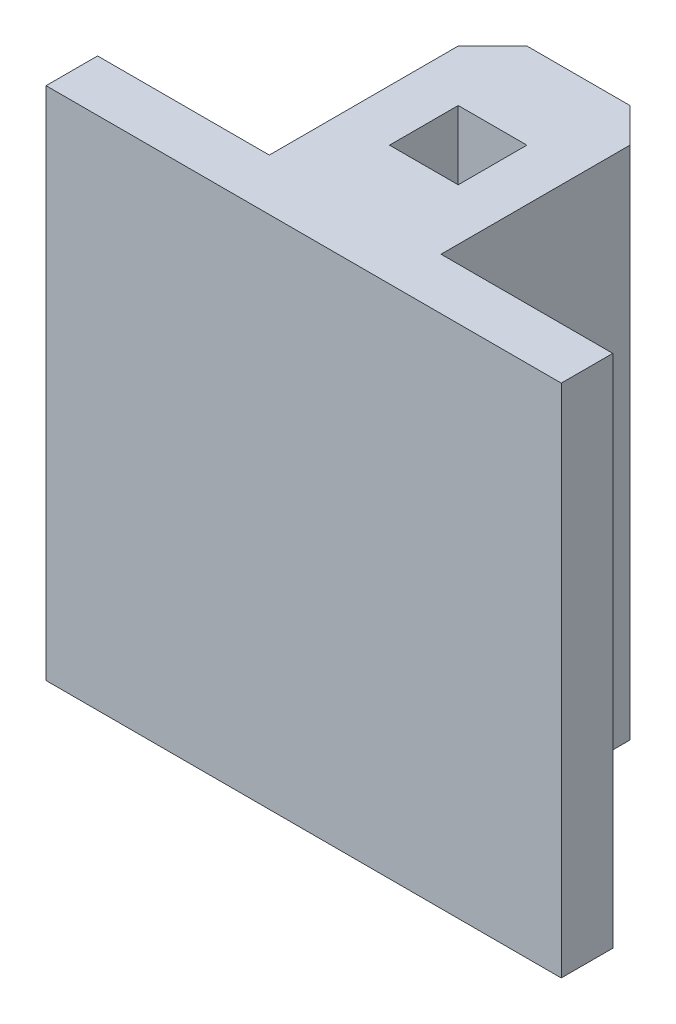
ISO-10303-21;
HEADER;
FILE_DESCRIPTION(('STEP AP214'),'2;1');
FILE_NAME('part.step','',(''),(''),'','','');
FILE_SCHEMA(('AUTOMOTIVE_DESIGN { 1 0 10303 214 1 1 1 1 }'));
ENDSEC;
DATA;
#1=APPLICATION_CONTEXT('core data for automotive mechanical design processes');
#2=APPLICATION_PROTOCOL_DEFINITION('international standard','automotive_design',2000,#1);
#3=PRODUCT_CONTEXT('',#1,'mechanical');
#4=PRODUCT('Part','Part','',(#3));
#5=PRODUCT_RELATED_PRODUCT_CATEGORY('part','',(#4));
#6=PRODUCT_DEFINITION_FORMATION('','',#4);
#7=PRODUCT_DEFINITION_CONTEXT('part definition',#1,'design');
#8=PRODUCT_DEFINITION('design','',#6,#7);
#9=PRODUCT_DEFINITION_SHAPE('','',#8);
#10=(LENGTH_UNIT() NAMED_UNIT(*) SI_UNIT(.MILLI.,.METRE.));
#11=(NAMED_UNIT(*) PLANE_ANGLE_UNIT() SI_UNIT($,.RADIAN.));
#12=(NAMED_UNIT(*) SI_UNIT($,.STERADIAN.) SOLID_ANGLE_UNIT());
#13=UNCERTAINTY_MEASURE_WITH_UNIT(LENGTH_MEASURE(1.E-05),#10,'distance_accuracy_value','');
#14=(GEOMETRIC_REPRESENTATION_CONTEXT(3) GLOBAL_UNCERTAINTY_ASSIGNED_CONTEXT((#13)) GLOBAL_UNIT_ASSIGNED_CONTEXT((#10,
#11,#12)) REPRESENTATION_CONTEXT('',''));
#15=CARTESIAN_POINT('',(0.,0.,0.));
#16=DIRECTION('',(0.,0.,1.));
#17=DIRECTION('',(1.,0.,0.));
#18=AXIS2_PLACEMENT_3D('',#15,#16,#17);
#19=CARTESIAN_POINT('',(0.,150.,0.));
#20=DIRECTION('',(0.,-1.,0.));
#21=DIRECTION('',(0.,0.,-1.));
#22=AXIS2_PLACEMENT_3D('',#19,#20,#21);
#23=PLANE('',#22);
#24=DIRECTION('',(0.,0.,-1.));
#25=VECTOR('',#24,1.);
#26=CARTESIAN_POINT('',(25.,150.,-35.));
#27=LINE('',#26,#25);
#28=CARTESIAN_POINT('',(25.,150.,30.));
#29=VERTEX_POINT('',#28);
#30=CARTESIAN_POINT('',(25.,150.,-25.));
#31=VERTEX_POINT('',#30);
#32=EDGE_CURVE('E214',#29,#31,#27,.T.);
#33=ORIENTED_EDGE('',*,*,#32,.T.);
#34=DIRECTION('',(0.707106781186547,0.,0.707106781186549));
#35=VECTOR('',#34,1.);
#36=CARTESIAN_POINT('',(15.,150.,-35.));
#37=LINE('',#36,#35);
#38=CARTESIAN_POINT('',(15.,150.,-35.));
#39=VERTEX_POINT('',#38);
#40=EDGE_CURVE('E50',#31,#39,#37,.F.);
#41=ORIENTED_EDGE('',*,*,#40,.T.);
#42=DIRECTION('',(-1.,0.,0.));
#43=VECTOR('',#42,1.);
#44=CARTESIAN_POINT('',(-25.,150.,-35.));
#45=LINE('',#44,#43);
#46=CARTESIAN_POINT('',(-15.,150.,-35.));
#47=VERTEX_POINT('',#46);
#48=EDGE_CURVE('E217',#39,#47,#45,.T.);
#49=ORIENTED_EDGE('',*,*,#48,.T.);
#50=DIRECTION('',(0.707106781186548,0.,-0.707106781186547));
#51=VECTOR('',#50,1.);
#52=CARTESIAN_POINT('',(-25.,150.,-25.));
#53=LINE('',#52,#51);
#54=CARTESIAN_POINT('',(-25.,150.,-25.));
#55=VERTEX_POINT('',#54);
#56=EDGE_CURVE('E57',#47,#55,#53,.F.);
#57=ORIENTED_EDGE('',*,*,#56,.T.);
#58=DIRECTION('',(0.,0.,1.));
#59=VECTOR('',#58,1.);
#60=CARTESIAN_POINT('',(-25.,150.,-35.));
#61=LINE('',#60,#59);
#62=CARTESIAN_POINT('',(-25.,150.,29.9999999999999));
#63=VERTEX_POINT('',#62);
#64=EDGE_CURVE('E220',#55,#63,#61,.T.);
#65=ORIENTED_EDGE('',*,*,#64,.T.);
#66=DIRECTION('',(-1.,0.,0.));
#67=VECTOR('',#66,1.);
#68=CARTESIAN_POINT('',(-25.,150.,29.9999999999999));
#69=LINE('',#68,#67);
#70=CARTESIAN_POINT('',(-75.,150.,29.9999999999999));
#71=VERTEX_POINT('',#70);
#72=EDGE_CURVE('E223',#63,#71,#69,.T.);
#73=ORIENTED_EDGE('',*,*,#72,.T.);
#74=DIRECTION('',(0.,0.,1.));
#75=VECTOR('',#74,1.);
#76=CARTESIAN_POINT('',(-75.,150.,29.9999999999999));
#77=LINE('',#76,#75);
#78=CARTESIAN_POINT('',(-75.,150.,45.));
#79=VERTEX_POINT('',#78);
#80=EDGE_CURVE('E200',#71,#79,#77,.T.);
#81=ORIENTED_EDGE('',*,*,#80,.T.);
#82=DIRECTION('',(1.,0.,0.));
#83=VECTOR('',#82,1.);
#84=CARTESIAN_POINT('',(75.,150.,45.0000000000001));
#85=LINE('',#84,#83);
#86=CARTESIAN_POINT('',(75.,150.,45.0000000000001));
#87=VERTEX_POINT('',#86);
#88=EDGE_CURVE('E204',#79,#87,#85,.T.);
#89=ORIENTED_EDGE('',*,*,#88,.T.);
#90=DIRECTION('',(0.,0.,-1.));
#91=VECTOR('',#90,1.);
#92=CARTESIAN_POINT('',(75.,150.,30.));
#93=LINE('',#92,#91);
#94=CARTESIAN_POINT('',(75.,150.,30.));
#95=VERTEX_POINT('',#94);
#96=EDGE_CURVE('E208',#87,#95,#93,.T.);
#97=ORIENTED_EDGE('',*,*,#96,.T.);
#98=DIRECTION('',(-1.,0.,0.));
#99=VECTOR('',#98,1.);
#100=CARTESIAN_POINT('',(25.,150.,30.));
#101=LINE('',#100,#99);
#102=EDGE_CURVE('E211',#95,#29,#101,.T.);
#103=ORIENTED_EDGE('',*,*,#102,.T.);
#104=EDGE_LOOP('',(#33,#41,#49,#57,#65,#73,#81,#89,#97,#103));
#105=FACE_BOUND('',#104,.T.);
#106=DIRECTION('',(0.,0.,-1.));
#107=VECTOR('',#106,1.);
#108=CARTESIAN_POINT('',(10.,150.,10.));
#109=LINE('',#108,#107);
#110=CARTESIAN_POINT('',(10.,150.,10.));
#111=VERTEX_POINT('',#110);
#112=CARTESIAN_POINT('',(10.,150.,-10.));
#113=VERTEX_POINT('',#112);
#114=EDGE_CURVE('E147',#111,#113,#109,.T.);
#115=ORIENTED_EDGE('',*,*,#114,.F.);
#116=DIRECTION('',(1.,0.,0.));
#117=VECTOR('',#116,1.);
#118=CARTESIAN_POINT('',(-10.,150.,10.));
#119=LINE('',#118,#117);
#120=CARTESIAN_POINT('',(-10.,150.,10.));
#121=VERTEX_POINT('',#120);
#122=EDGE_CURVE('E176',#121,#111,#119,.T.);
#123=ORIENTED_EDGE('',*,*,#122,.F.);
#124=DIRECTION('',(0.,0.,1.));
#125=VECTOR('',#124,1.);
#126=CARTESIAN_POINT('',(-10.,150.,10.));
#127=LINE('',#126,#125);
#128=CARTESIAN_POINT('',(-10.,150.,-10.));
#129=VERTEX_POINT('',#128);
#130=EDGE_CURVE('E172',#129,#121,#127,.T.);
#131=ORIENTED_EDGE('',*,*,#130,.F.);
#132=DIRECTION('',(-1.,0.,0.));
#133=VECTOR('',#132,1.);
#134=CARTESIAN_POINT('',(-10.,150.,-10.));
#135=LINE('',#134,#133);
#136=EDGE_CURVE('E158',#113,#129,#135,.T.);
#137=ORIENTED_EDGE('',*,*,#136,.F.);
#138=EDGE_LOOP('',(#115,#123,#131,#137));
#139=FACE_BOUND('',#138,.T.);
#140=ADVANCED_FACE('F40',(#105,#139),#23,.F.);
#141=CARTESIAN_POINT('',(0.,0.,0.));
#142=DIRECTION('',(0.,-1.,0.));
#143=DIRECTION('',(0.,0.,-1.));
#144=AXIS2_PLACEMENT_3D('',#141,#142,#143);
#145=PLANE('',#144);
#146=DIRECTION('',(-1.,0.,0.));
#147=VECTOR('',#146,1.);
#148=CARTESIAN_POINT('',(-25.,0.,-35.));
#149=LINE('',#148,#147);
#150=CARTESIAN_POINT('',(15.,0.,-35.));
#151=VERTEX_POINT('',#150);
#152=CARTESIAN_POINT('',(-15.,0.,-35.));
#153=VERTEX_POINT('',#152);
#154=EDGE_CURVE('E242',#151,#153,#149,.T.);
#155=ORIENTED_EDGE('',*,*,#154,.F.);
#156=DIRECTION('',(-0.707106781186547,0.,-0.707106781186549));
#157=VECTOR('',#156,1.);
#158=CARTESIAN_POINT('',(25.,0.,-25.));
#159=LINE('',#158,#157);
#160=CARTESIAN_POINT('',(25.,0.,-25.));
#161=VERTEX_POINT('',#160);
#162=EDGE_CURVE('E284',#151,#161,#159,.F.);
#163=ORIENTED_EDGE('',*,*,#162,.T.);
#164=DIRECTION('',(0.,0.,-1.));
#165=VECTOR('',#164,1.);
#166=CARTESIAN_POINT('',(25.,0.,-35.));
#167=LINE('',#166,#165);
#168=CARTESIAN_POINT('',(25.,0.,30.));
#169=VERTEX_POINT('',#168);
#170=EDGE_CURVE('E239',#169,#161,#167,.T.);
#171=ORIENTED_EDGE('',*,*,#170,.F.);
#172=DIRECTION('',(-1.,0.,0.));
#173=VECTOR('',#172,1.);
#174=CARTESIAN_POINT('',(25.,0.,30.));
#175=LINE('',#174,#173);
#176=CARTESIAN_POINT('',(75.,0.,30.));
#177=VERTEX_POINT('',#176);
#178=EDGE_CURVE('E236',#177,#169,#175,.T.);
#179=ORIENTED_EDGE('',*,*,#178,.F.);
#180=DIRECTION('',(0.,0.,-1.));
#181=VECTOR('',#180,1.);
#182=CARTESIAN_POINT('',(75.,0.,30.));
#183=LINE('',#182,#181);
#184=CARTESIAN_POINT('',(75.,0.,45.0000000000001));
#185=VERTEX_POINT('',#184);
#186=EDGE_CURVE('E233',#185,#177,#183,.T.);
#187=ORIENTED_EDGE('',*,*,#186,.F.);
#188=DIRECTION('',(1.,0.,0.));
#189=VECTOR('',#188,1.);
#190=CARTESIAN_POINT('',(75.,0.,45.0000000000001));
#191=LINE('',#190,#189);
#192=CARTESIAN_POINT('',(-75.,0.,45.));
#193=VERTEX_POINT('',#192);
#194=EDGE_CURVE('E230',#193,#185,#191,.T.);
#195=ORIENTED_EDGE('',*,*,#194,.F.);
#196=DIRECTION('',(0.,0.,1.));
#197=VECTOR('',#196,1.);
#198=CARTESIAN_POINT('',(-75.,0.,29.9999999999999));
#199=LINE('',#198,#197);
#200=CARTESIAN_POINT('',(-75.,0.,29.9999999999999));
#201=VERTEX_POINT('',#200);
#202=EDGE_CURVE('E167',#201,#193,#199,.T.);
#203=ORIENTED_EDGE('',*,*,#202,.F.);
#204=DIRECTION('',(-1.,0.,0.));
#205=VECTOR('',#204,1.);
#206=CARTESIAN_POINT('',(-25.,0.,29.9999999999999));
#207=LINE('',#206,#205);
#208=CARTESIAN_POINT('',(-25.,0.,29.9999999999999));
#209=VERTEX_POINT('',#208);
#210=EDGE_CURVE('E205',#209,#201,#207,.T.);
#211=ORIENTED_EDGE('',*,*,#210,.F.);
#212=DIRECTION('',(0.,0.,1.));
#213=VECTOR('',#212,1.);
#214=CARTESIAN_POINT('',(-25.,0.,-35.));
#215=LINE('',#214,#213);
#216=CARTESIAN_POINT('',(-25.,0.,-25.));
#217=VERTEX_POINT('',#216);
#218=EDGE_CURVE('E246',#217,#209,#215,.T.);
#219=ORIENTED_EDGE('',*,*,#218,.F.);
#220=DIRECTION('',(-0.707106781186548,0.,0.707106781186547));
#221=VECTOR('',#220,1.);
#222=CARTESIAN_POINT('',(-25.,0.,-25.));
#223=LINE('',#222,#221);
#224=EDGE_CURVE('E281',#217,#153,#223,.F.);
#225=ORIENTED_EDGE('',*,*,#224,.T.);
#226=EDGE_LOOP('',(#155,#163,#171,#179,#187,#195,#203,#211,#219,#225));
#227=FACE_BOUND('',#226,.T.);
#228=DIRECTION('',(1.,0.,0.));
#229=VECTOR('',#228,1.);
#230=CARTESIAN_POINT('',(-10.,0.,10.));
#231=LINE('',#230,#229);
#232=CARTESIAN_POINT('',(-10.,0.,10.));
#233=VERTEX_POINT('',#232);
#234=CARTESIAN_POINT('',(10.,0.,10.));
#235=VERTEX_POINT('',#234);
#236=EDGE_CURVE('E159',#233,#235,#231,.T.);
#237=ORIENTED_EDGE('',*,*,#236,.T.);
#238=DIRECTION('',(0.,0.,-1.));
#239=VECTOR('',#238,1.);
#240=CARTESIAN_POINT('',(10.,0.,10.));
#241=LINE('',#240,#239);
#242=CARTESIAN_POINT('',(10.,0.,-10.));
#243=VERTEX_POINT('',#242);
#244=EDGE_CURVE('E181',#235,#243,#241,.T.);
#245=ORIENTED_EDGE('',*,*,#244,.T.);
#246=DIRECTION('',(-1.,0.,0.));
#247=VECTOR('',#246,1.);
#248=CARTESIAN_POINT('',(-10.,0.,-10.));
#249=LINE('',#248,#247);
#250=CARTESIAN_POINT('',(-10.,0.,-10.));
#251=VERTEX_POINT('',#250);
#252=EDGE_CURVE('E165',#243,#251,#249,.T.);
#253=ORIENTED_EDGE('',*,*,#252,.T.);
#254=DIRECTION('',(0.,0.,1.));
#255=VECTOR('',#254,1.);
#256=CARTESIAN_POINT('',(-10.,0.,10.));
#257=LINE('',#256,#255);
#258=EDGE_CURVE('E186',#251,#233,#257,.T.);
#259=ORIENTED_EDGE('',*,*,#258,.T.);
#260=EDGE_LOOP('',(#237,#245,#253,#259));
#261=FACE_BOUND('',#260,.T.);
#262=ADVANCED_FACE('F302',(#227,#261),#145,.T.);
#263=CARTESIAN_POINT('',(-75.,150.,29.9999999999999));
#264=DIRECTION('',(1.,0.,0.));
#265=DIRECTION('',(0.,0.,-1.));
#266=AXIS2_PLACEMENT_3D('',#263,#264,#265);
#267=PLANE('',#266);
#268=ORIENTED_EDGE('',*,*,#202,.T.);
#269=DIRECTION('',(0.,-1.,0.));
#270=VECTOR('',#269,1.);
#271=CARTESIAN_POINT('',(-75.,150.,45.));
#272=LINE('',#271,#270);
#273=EDGE_CURVE('E270',#79,#193,#272,.T.);
#274=ORIENTED_EDGE('',*,*,#273,.F.);
#275=ORIENTED_EDGE('',*,*,#80,.F.);
#276=DIRECTION('',(0.,-1.,0.));
#277=VECTOR('',#276,1.);
#278=CARTESIAN_POINT('',(-75.,150.,29.9999999999999));
#279=LINE('',#278,#277);
#280=EDGE_CURVE('E226',#71,#201,#279,.T.);
#281=ORIENTED_EDGE('',*,*,#280,.T.);
#282=EDGE_LOOP('',(#268,#274,#275,#281));
#283=FACE_BOUND('',#282,.T.);
#284=ADVANCED_FACE('F322',(#283),#267,.F.);
#285=CARTESIAN_POINT('',(75.,150.,45.0000000000001));
#286=DIRECTION('',(0.,0.,-1.));
#287=DIRECTION('',(-1.,0.,0.));
#288=AXIS2_PLACEMENT_3D('',#285,#286,#287);
#289=PLANE('',#288);
#290=ORIENTED_EDGE('',*,*,#194,.T.);
#291=DIRECTION('',(0.,-1.,0.));
#292=VECTOR('',#291,1.);
#293=CARTESIAN_POINT('',(75.,150.,45.0000000000001));
#294=LINE('',#293,#292);
#295=EDGE_CURVE('E266',#87,#185,#294,.T.);
#296=ORIENTED_EDGE('',*,*,#295,.F.);
#297=ORIENTED_EDGE('',*,*,#88,.F.);
#298=ORIENTED_EDGE('',*,*,#273,.T.);
#299=EDGE_LOOP('',(#290,#296,#297,#298));
#300=FACE_BOUND('',#299,.T.);
#301=ADVANCED_FACE('F318',(#300),#289,.F.);
#302=CARTESIAN_POINT('',(75.,150.,30.));
#303=DIRECTION('',(-1.,0.,0.));
#304=DIRECTION('',(0.,0.,1.));
#305=AXIS2_PLACEMENT_3D('',#302,#303,#304);
#306=PLANE('',#305);
#307=ORIENTED_EDGE('',*,*,#186,.T.);
#308=DIRECTION('',(0.,-1.,0.));
#309=VECTOR('',#308,1.);
#310=CARTESIAN_POINT('',(75.,150.,30.));
#311=LINE('',#310,#309);
#312=EDGE_CURVE('E262',#95,#177,#311,.T.);
#313=ORIENTED_EDGE('',*,*,#312,.F.);
#314=ORIENTED_EDGE('',*,*,#96,.F.);
#315=ORIENTED_EDGE('',*,*,#295,.T.);
#316=EDGE_LOOP('',(#307,#313,#314,#315));
#317=FACE_BOUND('',#316,.T.);
#318=ADVANCED_FACE('F314',(#317),#306,.F.);
#319=CARTESIAN_POINT('',(25.,150.,30.));
#320=DIRECTION('',(0.,0.,1.));
#321=DIRECTION('',(1.,0.,0.));
#322=AXIS2_PLACEMENT_3D('',#319,#320,#321);
#323=PLANE('',#322);
#324=ORIENTED_EDGE('',*,*,#178,.T.);
#325=DIRECTION('',(0.,-1.,0.));
#326=VECTOR('',#325,1.);
#327=CARTESIAN_POINT('',(25.,150.,30.));
#328=LINE('',#327,#326);
#329=EDGE_CURVE('E258',#29,#169,#328,.T.);
#330=ORIENTED_EDGE('',*,*,#329,.F.);
#331=ORIENTED_EDGE('',*,*,#102,.F.);
#332=ORIENTED_EDGE('',*,*,#312,.T.);
#333=EDGE_LOOP('',(#324,#330,#331,#332));
#334=FACE_BOUND('',#333,.T.);
#335=ADVANCED_FACE('F309',(#334),#323,.F.);
#336=CARTESIAN_POINT('',(25.,150.,-35.));
#337=DIRECTION('',(-1.,0.,0.));
#338=DIRECTION('',(0.,0.,1.));
#339=AXIS2_PLACEMENT_3D('',#336,#337,#338);
#340=PLANE('',#339);
#341=ORIENTED_EDGE('',*,*,#170,.T.);
#342=DIRECTION('',(0.,1.,0.));
#343=VECTOR('',#342,1.);
#344=CARTESIAN_POINT('',(25.,150.,-25.));
#345=LINE('',#344,#343);
#346=EDGE_CURVE('E65',#161,#31,#345,.T.);
#347=ORIENTED_EDGE('',*,*,#346,.T.);
#348=ORIENTED_EDGE('',*,*,#32,.F.);
#349=ORIENTED_EDGE('',*,*,#329,.T.);
#350=EDGE_LOOP('',(#341,#347,#348,#349));
#351=FACE_BOUND('',#350,.T.);
#352=ADVANCED_FACE('F305',(#351),#340,.F.);
#353=CARTESIAN_POINT('',(-25.,150.,-35.));
#354=DIRECTION('',(0.,0.,1.));
#355=DIRECTION('',(1.,0.,0.));
#356=AXIS2_PLACEMENT_3D('',#353,#354,#355);
#357=PLANE('',#356);
#358=ORIENTED_EDGE('',*,*,#48,.F.);
#359=DIRECTION('',(0.,-1.,0.));
#360=VECTOR('',#359,1.);
#361=CARTESIAN_POINT('',(15.,150.,-35.));
#362=LINE('',#361,#360);
#363=EDGE_CURVE('E277',#39,#151,#362,.T.);
#364=ORIENTED_EDGE('',*,*,#363,.T.);
#365=ORIENTED_EDGE('',*,*,#154,.T.);
#366=DIRECTION('',(0.,1.,0.));
#367=VECTOR('',#366,1.);
#368=CARTESIAN_POINT('',(-15.,150.,-35.));
#369=LINE('',#368,#367);
#370=EDGE_CURVE('E274',#153,#47,#369,.T.);
#371=ORIENTED_EDGE('',*,*,#370,.T.);
#372=EDGE_LOOP('',(#358,#364,#365,#371));
#373=FACE_BOUND('',#372,.T.);
#374=ADVANCED_FACE('F296',(#373),#357,.F.);
#375=CARTESIAN_POINT('',(-25.,150.,-35.));
#376=DIRECTION('',(1.,0.,0.));
#377=DIRECTION('',(0.,0.,-1.));
#378=AXIS2_PLACEMENT_3D('',#375,#376,#377);
#379=PLANE('',#378);
#380=ORIENTED_EDGE('',*,*,#64,.F.);
#381=DIRECTION('',(0.,-1.,0.));
#382=VECTOR('',#381,1.);
#383=CARTESIAN_POINT('',(-25.,150.,-25.));
#384=LINE('',#383,#382);
#385=EDGE_CURVE('E11',#55,#217,#384,.T.);
#386=ORIENTED_EDGE('',*,*,#385,.T.);
#387=ORIENTED_EDGE('',*,*,#218,.T.);
#388=DIRECTION('',(0.,-1.,0.));
#389=VECTOR('',#388,1.);
#390=CARTESIAN_POINT('',(-25.,150.,29.9999999999999));
#391=LINE('',#390,#389);
#392=EDGE_CURVE('E254',#63,#209,#391,.T.);
#393=ORIENTED_EDGE('',*,*,#392,.F.);
#394=EDGE_LOOP('',(#380,#386,#387,#393));
#395=FACE_BOUND('',#394,.T.);
#396=ADVANCED_FACE('F331',(#395),#379,.F.);
#397=CARTESIAN_POINT('',(-25.,150.,29.9999999999999));
#398=DIRECTION('',(0.,0.,1.));
#399=DIRECTION('',(1.,0.,0.));
#400=AXIS2_PLACEMENT_3D('',#397,#398,#399);
#401=PLANE('',#400);
#402=ORIENTED_EDGE('',*,*,#210,.T.);
#403=ORIENTED_EDGE('',*,*,#280,.F.);
#404=ORIENTED_EDGE('',*,*,#72,.F.);
#405=ORIENTED_EDGE('',*,*,#392,.T.);
#406=EDGE_LOOP('',(#402,#403,#404,#405));
#407=FACE_BOUND('',#406,.T.);
#408=ADVANCED_FACE('F327',(#407),#401,.F.);
#409=CARTESIAN_POINT('',(10.,150.,10.));
#410=DIRECTION('',(-1.,0.,0.));
#411=DIRECTION('',(0.,0.,1.));
#412=AXIS2_PLACEMENT_3D('',#409,#410,#411);
#413=PLANE('',#412);
#414=ORIENTED_EDGE('',*,*,#244,.F.);
#415=DIRECTION('',(0.,-1.,0.));
#416=VECTOR('',#415,1.);
#417=CARTESIAN_POINT('',(10.,150.,10.));
#418=LINE('',#417,#416);
#419=EDGE_CURVE('E153',#111,#235,#418,.T.);
#420=ORIENTED_EDGE('',*,*,#419,.F.);
#421=ORIENTED_EDGE('',*,*,#114,.T.);
#422=DIRECTION('',(0.,-1.,0.));
#423=VECTOR('',#422,1.);
#424=CARTESIAN_POINT('',(10.,150.,-10.));
#425=LINE('',#424,#423);
#426=EDGE_CURVE('E150',#113,#243,#425,.T.);
#427=ORIENTED_EDGE('',*,*,#426,.T.);
#428=EDGE_LOOP('',(#414,#420,#421,#427));
#429=FACE_BOUND('',#428,.T.);
#430=ADVANCED_FACE('F149',(#429),#413,.T.);
#431=CARTESIAN_POINT('',(-10.,150.,-10.));
#432=DIRECTION('',(0.,0.,1.));
#433=DIRECTION('',(1.,0.,0.));
#434=AXIS2_PLACEMENT_3D('',#431,#432,#433);
#435=PLANE('',#434);
#436=ORIENTED_EDGE('',*,*,#252,.F.);
#437=ORIENTED_EDGE('',*,*,#426,.F.);
#438=ORIENTED_EDGE('',*,*,#136,.T.);
#439=DIRECTION('',(0.,-1.,0.));
#440=VECTOR('',#439,1.);
#441=CARTESIAN_POINT('',(-10.,150.,-10.));
#442=LINE('',#441,#440);
#443=EDGE_CURVE('E168',#129,#251,#442,.T.);
#444=ORIENTED_EDGE('',*,*,#443,.T.);
#445=EDGE_LOOP('',(#436,#437,#438,#444));
#446=FACE_BOUND('',#445,.T.);
#447=ADVANCED_FACE('F162',(#446),#435,.T.);
#448=CARTESIAN_POINT('',(-10.,150.,10.));
#449=DIRECTION('',(1.,0.,0.));
#450=DIRECTION('',(0.,0.,-1.));
#451=AXIS2_PLACEMENT_3D('',#448,#449,#450);
#452=PLANE('',#451);
#453=ORIENTED_EDGE('',*,*,#258,.F.);
#454=ORIENTED_EDGE('',*,*,#443,.F.);
#455=ORIENTED_EDGE('',*,*,#130,.T.);
#456=DIRECTION('',(0.,-1.,0.));
#457=VECTOR('',#456,1.);
#458=CARTESIAN_POINT('',(-10.,150.,10.));
#459=LINE('',#458,#457);
#460=EDGE_CURVE('E195',#121,#233,#459,.T.);
#461=ORIENTED_EDGE('',*,*,#460,.T.);
#462=EDGE_LOOP('',(#453,#454,#455,#461));
#463=FACE_BOUND('',#462,.T.);
#464=ADVANCED_FACE('F420',(#463),#452,.T.);
#465=CARTESIAN_POINT('',(-10.,150.,10.));
#466=DIRECTION('',(0.,0.,-1.));
#467=DIRECTION('',(-1.,0.,0.));
#468=AXIS2_PLACEMENT_3D('',#465,#466,#467);
#469=PLANE('',#468);
#470=ORIENTED_EDGE('',*,*,#236,.F.);
#471=ORIENTED_EDGE('',*,*,#460,.F.);
#472=ORIENTED_EDGE('',*,*,#122,.T.);
#473=ORIENTED_EDGE('',*,*,#419,.T.);
#474=EDGE_LOOP('',(#470,#471,#472,#473));
#475=FACE_BOUND('',#474,.T.);
#476=ADVANCED_FACE('F338',(#475),#469,.T.);
#477=CARTESIAN_POINT('',(15.,150.,-35.));
#478=DIRECTION('',(-0.707106781186549,0.,0.707106781186547));
#479=DIRECTION('',(0.,-1.,0.));
#480=AXIS2_PLACEMENT_3D('',#477,#478,#479);
#481=PLANE('',#480);
#482=ORIENTED_EDGE('',*,*,#40,.F.);
#483=ORIENTED_EDGE('',*,*,#346,.F.);
#484=ORIENTED_EDGE('',*,*,#162,.F.);
#485=ORIENTED_EDGE('',*,*,#363,.F.);
#486=EDGE_LOOP('',(#482,#483,#484,#485));
#487=FACE_BOUND('',#486,.T.);
#488=ADVANCED_FACE('F299',(#487),#481,.F.);
#489=CARTESIAN_POINT('',(-25.,150.,-25.));
#490=DIRECTION('',(0.707106781186547,0.,0.707106781186548));
#491=DIRECTION('',(0.,-1.,0.));
#492=AXIS2_PLACEMENT_3D('',#489,#490,#491);
#493=PLANE('',#492);
#494=ORIENTED_EDGE('',*,*,#56,.F.);
#495=ORIENTED_EDGE('',*,*,#370,.F.);
#496=ORIENTED_EDGE('',*,*,#224,.F.);
#497=ORIENTED_EDGE('',*,*,#385,.F.);
#498=EDGE_LOOP('',(#494,#495,#496,#497));
#499=FACE_BOUND('',#498,.T.);
#500=ADVANCED_FACE('F43',(#499),#493,.F.);
#501=CLOSED_SHELL('',(#140,#262,#284,#301,#318,#335,#352,#374,#396,#408,#430,#447,#464,#476,
#488,#500));
#502=MANIFOLD_SOLID_BREP('B2',#501);
#503=ADVANCED_BREP_SHAPE_REPRESENTATION('',(#18,#502),#14);
#504=SHAPE_DEFINITION_REPRESENTATION(#9,#503);
ENDSEC;
END-ISO-10303-21;
